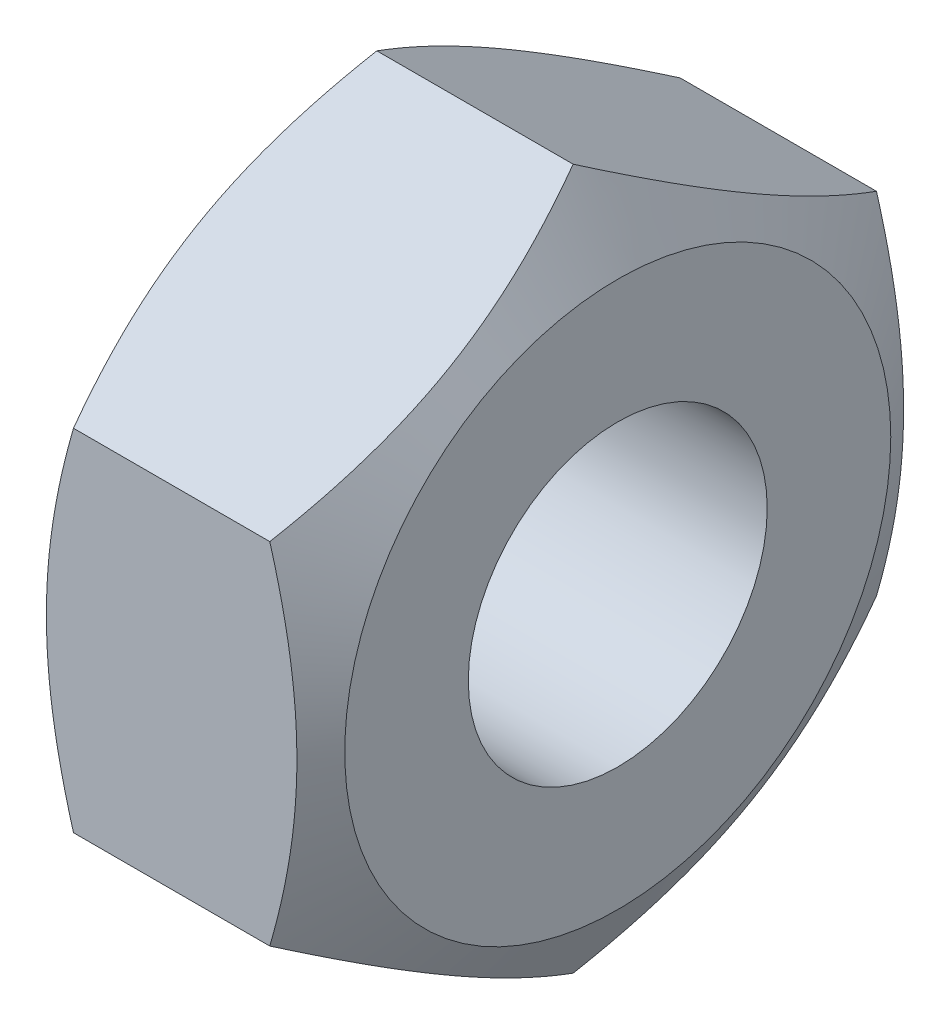
ISO-10303-21;
HEADER;
FILE_DESCRIPTION(('STEP AP214'),'2;1');
FILE_NAME('part.step','',(''),(''),'','','');
FILE_SCHEMA(('AUTOMOTIVE_DESIGN { 1 0 10303 214 1 1 1 1 }'));
ENDSEC;
DATA;
#1=APPLICATION_CONTEXT('core data for automotive mechanical design processes');
#2=APPLICATION_PROTOCOL_DEFINITION('international standard','automotive_design',2000,#1);
#3=PRODUCT_CONTEXT('',#1,'mechanical');
#4=PRODUCT('Part','Part','',(#3));
#5=PRODUCT_RELATED_PRODUCT_CATEGORY('part','',(#4));
#6=PRODUCT_DEFINITION_FORMATION('','',#4);
#7=PRODUCT_DEFINITION_CONTEXT('part definition',#1,'design');
#8=PRODUCT_DEFINITION('design','',#6,#7);
#9=PRODUCT_DEFINITION_SHAPE('','',#8);
#10=(LENGTH_UNIT() NAMED_UNIT(*) SI_UNIT(.MILLI.,.METRE.));
#11=(NAMED_UNIT(*) PLANE_ANGLE_UNIT() SI_UNIT($,.RADIAN.));
#12=(NAMED_UNIT(*) SI_UNIT($,.STERADIAN.) SOLID_ANGLE_UNIT());
#13=UNCERTAINTY_MEASURE_WITH_UNIT(LENGTH_MEASURE(1.E-05),#10,'distance_accuracy_value','');
#14=(GEOMETRIC_REPRESENTATION_CONTEXT(3) GLOBAL_UNCERTAINTY_ASSIGNED_CONTEXT((#13)) GLOBAL_UNIT_ASSIGNED_CONTEXT((#10,
#11,#12)) REPRESENTATION_CONTEXT('',''));
#15=CARTESIAN_POINT('',(0.,0.,0.));
#16=DIRECTION('',(0.,0.,1.));
#17=DIRECTION('',(1.,0.,0.));
#18=AXIS2_PLACEMENT_3D('',#15,#16,#17);
#19=CARTESIAN_POINT('',(9.,-4.90747728811182,8.5));
#20=DIRECTION('',(0.,0.866025403784439,-0.5));
#21=DIRECTION('',(-1.,0.,0.));
#22=AXIS2_PLACEMENT_3D('',#19,#20,#21);
#23=PLANE('',#22);
#24=DIRECTION('',(-1.,0.,0.));
#25=VECTOR('',#24,1.);
#26=CARTESIAN_POINT('',(9.,-9.81495457622364,0.));
#27=LINE('',#26,#25);
#28=CARTESIAN_POINT('',(6.75006289263397,-9.81495457622364,0.));
#29=VERTEX_POINT('',#28);
#30=CARTESIAN_POINT('',(1.24993710736603,-9.81495457622364,0.));
#31=VERTEX_POINT('',#30);
#32=EDGE_CURVE('E11',#29,#31,#27,.T.);
#33=ORIENTED_EDGE('',*,*,#32,.F.);
#34=CARTESIAN_POINT('',(6.75006289262925,-4.90747728810365,8.50000000001416));
#35=CARTESIAN_POINT('',(8.16672955930417,-7.36121593216773,4.25));
#36=CARTESIAN_POINT('',(6.75006289262925,-9.8149545762318,-1.41468096338611E-11));
#37=(BOUNDED_CURVE() B_SPLINE_CURVE(2,(#34,#35,#36),.UNSPECIFIED.,.F.,
.F.) B_SPLINE_CURVE_WITH_KNOTS((3,3),(-3.28197856606582,-1.43629970297824),
.UNSPECIFIED.) CURVE() GEOMETRIC_REPRESENTATION_ITEM() RATIONAL_B_SPLINE_CURVE((1.74869346263732,
2.01921728276927,1.74869346263732)) REPRESENTATION_ITEM(''));
#38=CARTESIAN_POINT('',(6.75006289263397,-4.90747728811182,8.5));
#39=VERTEX_POINT('',#38);
#40=EDGE_CURVE('E203',#39,#29,#37,.T.);
#41=ORIENTED_EDGE('',*,*,#40,.F.);
#42=DIRECTION('',(-1.,0.,0.));
#43=VECTOR('',#42,1.);
#44=CARTESIAN_POINT('',(9.,-4.90747728811182,8.5));
#45=LINE('',#44,#43);
#46=CARTESIAN_POINT('',(1.24993710736603,-4.90747728811182,8.5));
#47=VERTEX_POINT('',#46);
#48=EDGE_CURVE('E237',#39,#47,#45,.T.);
#49=ORIENTED_EDGE('',*,*,#48,.T.);
#50=CARTESIAN_POINT('',(1.24993710736889,-9.8149545762286,-8.60834302735103E-12));
#51=CARTESIAN_POINT('',(-0.166729559302786,-7.36121593216773,4.25));
#52=CARTESIAN_POINT('',(1.24993710736889,-4.90747728810685,8.50000000000861));
#53=(BOUNDED_CURVE() B_SPLINE_CURVE(2,(#50,#51,#52),.UNSPECIFIED.,.F.,
.F.) B_SPLINE_CURVE_WITH_KNOTS((3,3),(-3.14718166720087,-1.35643726516677),
.UNSPECIFIED.) CURVE() GEOMETRIC_REPRESENTATION_ITEM() RATIONAL_B_SPLINE_CURVE((1.70034817503808,
1.96339295314964,1.70034817503808)) REPRESENTATION_ITEM(''));
#54=EDGE_CURVE('E147',#31,#47,#53,.T.);
#55=ORIENTED_EDGE('',*,*,#54,.F.);
#56=EDGE_LOOP('',(#33,#41,#49,#55));
#57=FACE_BOUND('',#56,.T.);
#58=ADVANCED_FACE('F17',(#57),#23,.F.);
#59=CARTESIAN_POINT('',(9.,-9.81495457622364,0.));
#60=DIRECTION('',(0.,0.866025403784439,0.5));
#61=DIRECTION('',(1.,0.,0.));
#62=AXIS2_PLACEMENT_3D('',#59,#60,#61);
#63=PLANE('',#62);
#64=DIRECTION('',(-1.,0.,0.));
#65=VECTOR('',#64,1.);
#66=CARTESIAN_POINT('',(9.,-4.90747728811182,-8.5));
#67=LINE('',#66,#65);
#68=CARTESIAN_POINT('',(6.75006289263397,-4.90747728811182,-8.5));
#69=VERTEX_POINT('',#68);
#70=CARTESIAN_POINT('',(1.24993710736603,-4.90747728811182,-8.5));
#71=VERTEX_POINT('',#70);
#72=EDGE_CURVE('E25',#69,#71,#67,.T.);
#73=ORIENTED_EDGE('',*,*,#72,.F.);
#74=CARTESIAN_POINT('',(6.75006289262925,-9.8149545762318,1.41605231964976E-11));
#75=CARTESIAN_POINT('',(8.16672955930417,-7.36121593216774,-4.24999999999999));
#76=CARTESIAN_POINT('',(6.75006289262925,-4.90747728810366,-8.50000000001414));
#77=(BOUNDED_CURVE() B_SPLINE_CURVE(2,(#74,#75,#76),.UNSPECIFIED.,.F.,
.F.) B_SPLINE_CURVE_WITH_KNOTS((3,3),(-3.28197856606582,-1.43629970297824),
.UNSPECIFIED.) CURVE() GEOMETRIC_REPRESENTATION_ITEM() RATIONAL_B_SPLINE_CURVE((1.74869346263732,
2.01921728276927,1.74869346263732)) REPRESENTATION_ITEM(''));
#78=EDGE_CURVE('E358',#29,#69,#77,.T.);
#79=ORIENTED_EDGE('',*,*,#78,.F.);
#80=ORIENTED_EDGE('',*,*,#32,.T.);
#81=CARTESIAN_POINT('',(1.2499371073689,-4.90747728810685,-8.50000000000862));
#82=CARTESIAN_POINT('',(-0.166729559302785,-7.36121593216773,-4.25000000000001));
#83=CARTESIAN_POINT('',(1.24993710736889,-9.8149545762286,8.60259716732064E-12));
#84=(BOUNDED_CURVE() B_SPLINE_CURVE(2,(#81,#82,#83),.UNSPECIFIED.,.F.,
.F.) B_SPLINE_CURVE_WITH_KNOTS((3,3),(-3.14718166720087,-1.35643726516677),
.UNSPECIFIED.) CURVE() GEOMETRIC_REPRESENTATION_ITEM() RATIONAL_B_SPLINE_CURVE((1.70034817503808,
1.96339295314964,1.70034817503808)) REPRESENTATION_ITEM(''));
#85=EDGE_CURVE('E128',#71,#31,#84,.T.);
#86=ORIENTED_EDGE('',*,*,#85,.F.);
#87=EDGE_LOOP('',(#73,#79,#80,#86));
#88=FACE_BOUND('',#87,.T.);
#89=ADVANCED_FACE('F321',(#88),#63,.F.);
#90=CARTESIAN_POINT('',(9.,-4.90747728811182,-8.5));
#91=DIRECTION('',(0.,0.,1.));
#92=DIRECTION('',(1.,0.,0.));
#93=AXIS2_PLACEMENT_3D('',#90,#91,#92);
#94=PLANE('',#93);
#95=DIRECTION('',(-1.,0.,0.));
#96=VECTOR('',#95,1.);
#97=CARTESIAN_POINT('',(9.,4.90747728811182,-8.5));
#98=LINE('',#97,#96);
#99=CARTESIAN_POINT('',(6.75006289263397,4.90747728811182,-8.5));
#100=VERTEX_POINT('',#99);
#101=CARTESIAN_POINT('',(1.24993710736603,4.90747728811182,-8.5));
#102=VERTEX_POINT('',#101);
#103=EDGE_CURVE('E46',#100,#102,#98,.T.);
#104=ORIENTED_EDGE('',*,*,#103,.F.);
#105=CARTESIAN_POINT('',(7.50925227118881,0.,-8.50000000000001));
#106=CARTESIAN_POINT('',(7.50925227118881,2.27756813567111,-8.50000000000001));
#107=CARTESIAN_POINT('',(6.75006289262925,4.90747728812815,-8.49999999999999));
#108=(BOUNDED_CURVE() B_SPLINE_CURVE(2,(#105,#106,#107),.UNSPECIFIED.,.F.,
.F.) B_SPLINE_CURVE_WITH_KNOTS((3,3),(-2.359139134522,-1.43629970297822),
.UNSPECIFIED.) CURVE() GEOMETRIC_REPRESENTATION_ITEM() RATIONAL_B_SPLINE_CURVE((1.88395537270328,
1.88395537270328,1.7486934626373)) REPRESENTATION_ITEM(''));
#109=CARTESIAN_POINT('',(7.50925227118881,0.,-8.5));
#110=VERTEX_POINT('',#109);
#111=EDGE_CURVE('E217',#110,#100,#108,.T.);
#112=ORIENTED_EDGE('',*,*,#111,.F.);
#113=CARTESIAN_POINT('',(6.75006289262925,-4.90747728812815,-8.49999999999999));
#114=CARTESIAN_POINT('',(7.50925227118881,-2.27756813567111,-8.50000000000001));
#115=CARTESIAN_POINT('',(7.50925227118881,0.,-8.50000000000001));
#116=(BOUNDED_CURVE() B_SPLINE_CURVE(2,(#113,#114,#115),.UNSPECIFIED.,.F.,
.F.) B_SPLINE_CURVE_WITH_KNOTS((3,3),(-3.28197856606577,-2.359139134522),
.UNSPECIFIED.) CURVE() GEOMETRIC_REPRESENTATION_ITEM() RATIONAL_B_SPLINE_CURVE((1.7486934626373,
1.88395537270328,1.88395537270328)) REPRESENTATION_ITEM(''));
#117=EDGE_CURVE('E214',#69,#110,#116,.T.);
#118=ORIENTED_EDGE('',*,*,#117,.F.);
#119=ORIENTED_EDGE('',*,*,#72,.T.);
#120=CARTESIAN_POINT('',(1.24993710736868,4.90747728812104,-8.5));
#121=CARTESIAN_POINT('',(-0.166729559302632,0.,-8.5));
#122=CARTESIAN_POINT('',(1.24993710736868,-4.90747728812104,-8.5));
#123=(BOUNDED_CURVE() B_SPLINE_CURVE(2,(#120,#121,#122),.UNSPECIFIED.,.F.,
.F.) B_SPLINE_CURVE_WITH_KNOTS((3,3),(-3.1279193957715,-1.345009786714),
.UNSPECIFIED.) CURVE() GEOMETRIC_REPRESENTATION_ITEM() RATIONAL_B_SPLINE_CURVE((1.69345376639804,
1.9554319757811,1.69345376639804)) REPRESENTATION_ITEM(''));
#124=EDGE_CURVE('E121',#102,#71,#123,.T.);
#125=ORIENTED_EDGE('',*,*,#124,.F.);
#126=EDGE_LOOP('',(#104,#112,#118,#119,#125));
#127=FACE_BOUND('',#126,.T.);
#128=ADVANCED_FACE('F122',(#127),#94,.F.);
#129=CARTESIAN_POINT('',(9.,4.90747728811182,-8.5));
#130=DIRECTION('',(0.,-0.866025403784439,0.5));
#131=DIRECTION('',(-1.,0.,0.));
#132=AXIS2_PLACEMENT_3D('',#129,#130,#131);
#133=PLANE('',#132);
#134=DIRECTION('',(-1.,0.,0.));
#135=VECTOR('',#134,1.);
#136=CARTESIAN_POINT('',(9.,9.81495457622364,0.));
#137=LINE('',#136,#135);
#138=CARTESIAN_POINT('',(6.75006289263397,9.81495457622364,0.));
#139=VERTEX_POINT('',#138);
#140=CARTESIAN_POINT('',(1.24993710736603,9.81495457622364,0.));
#141=VERTEX_POINT('',#140);
#142=EDGE_CURVE('E118',#139,#141,#137,.T.);
#143=ORIENTED_EDGE('',*,*,#142,.F.);
#144=CARTESIAN_POINT('',(6.75006289262925,4.90747728810365,-8.50000000001416));
#145=CARTESIAN_POINT('',(8.16672955930417,7.36121593216773,-4.25));
#146=CARTESIAN_POINT('',(6.75006289262925,9.8149545762318,1.41468096338611E-11));
#147=(BOUNDED_CURVE() B_SPLINE_CURVE(2,(#144,#145,#146),.UNSPECIFIED.,.F.,
.F.) B_SPLINE_CURVE_WITH_KNOTS((3,3),(-3.28197856606582,-1.43629970297824),
.UNSPECIFIED.) CURVE() GEOMETRIC_REPRESENTATION_ITEM() RATIONAL_B_SPLINE_CURVE((1.74869346263732,
2.01921728276927,1.74869346263732)) REPRESENTATION_ITEM(''));
#148=EDGE_CURVE('E115',#100,#139,#147,.T.);
#149=ORIENTED_EDGE('',*,*,#148,.F.);
#150=ORIENTED_EDGE('',*,*,#103,.T.);
#151=CARTESIAN_POINT('',(1.24993710736889,9.8149545762286,8.60834302735103E-12));
#152=CARTESIAN_POINT('',(-0.166729559302786,7.36121593216773,-4.25));
#153=CARTESIAN_POINT('',(1.24993710736889,4.90747728810685,-8.50000000000861));
#154=(BOUNDED_CURVE() B_SPLINE_CURVE(2,(#151,#152,#153),.UNSPECIFIED.,.F.,
.F.) B_SPLINE_CURVE_WITH_KNOTS((3,3),(-3.14718166720087,-1.35643726516677),
.UNSPECIFIED.) CURVE() GEOMETRIC_REPRESENTATION_ITEM() RATIONAL_B_SPLINE_CURVE((1.70034817503808,
1.96339295314964,1.70034817503808)) REPRESENTATION_ITEM(''));
#155=EDGE_CURVE('E112',#141,#102,#154,.T.);
#156=ORIENTED_EDGE('',*,*,#155,.F.);
#157=EDGE_LOOP('',(#143,#149,#150,#156));
#158=FACE_BOUND('',#157,.T.);
#159=ADVANCED_FACE('F110',(#158),#133,.F.);
#160=CARTESIAN_POINT('',(9.,9.81495457622364,0.));
#161=DIRECTION('',(0.,-0.866025403784439,-0.5));
#162=DIRECTION('',(0.,0.5,-0.866025403784439));
#163=AXIS2_PLACEMENT_3D('',#160,#161,#162);
#164=PLANE('',#163);
#165=DIRECTION('',(-1.,0.,0.));
#166=VECTOR('',#165,1.);
#167=CARTESIAN_POINT('',(9.,4.90747728811182,8.5));
#168=LINE('',#167,#166);
#169=CARTESIAN_POINT('',(6.75006289263397,4.90747728811182,8.5));
#170=VERTEX_POINT('',#169);
#171=CARTESIAN_POINT('',(1.24993710736603,4.90747728811182,8.5));
#172=VERTEX_POINT('',#171);
#173=EDGE_CURVE('E240',#170,#172,#168,.T.);
#174=ORIENTED_EDGE('',*,*,#173,.F.);
#175=CARTESIAN_POINT('',(6.75006289262923,9.81495457623183,-1.41691576618614E-11));
#176=CARTESIAN_POINT('',(8.16672955930417,7.36121593216774,4.24999999999999));
#177=CARTESIAN_POINT('',(6.75006289262925,4.90747728810366,8.50000000001414));
#178=(BOUNDED_CURVE() B_SPLINE_CURVE(2,(#175,#176,#177),.UNSPECIFIED.,.F.,
.F.) B_SPLINE_CURVE_WITH_KNOTS((3,3),(-3.28197856606582,-1.43629970297824),
.UNSPECIFIED.) CURVE() GEOMETRIC_REPRESENTATION_ITEM() RATIONAL_B_SPLINE_CURVE((1.74869346263732,
2.01921728276927,1.74869346263732)) REPRESENTATION_ITEM(''));
#179=EDGE_CURVE('E156',#139,#170,#178,.T.);
#180=ORIENTED_EDGE('',*,*,#179,.F.);
#181=ORIENTED_EDGE('',*,*,#142,.T.);
#182=CARTESIAN_POINT('',(1.2499371073689,4.90747728810685,8.50000000000862));
#183=CARTESIAN_POINT('',(-0.166729559302785,7.36121593216773,4.25000000000001));
#184=CARTESIAN_POINT('',(1.24993710736889,9.8149545762286,-8.60259716732064E-12));
#185=(BOUNDED_CURVE() B_SPLINE_CURVE(2,(#182,#183,#184),.UNSPECIFIED.,.F.,
.F.) B_SPLINE_CURVE_WITH_KNOTS((3,3),(-3.14718166720087,-1.35643726516677),
.UNSPECIFIED.) CURVE() GEOMETRIC_REPRESENTATION_ITEM() RATIONAL_B_SPLINE_CURVE((1.70034817503808,
1.96339295314964,1.70034817503808)) REPRESENTATION_ITEM(''));
#186=EDGE_CURVE('E133',#172,#141,#185,.T.);
#187=ORIENTED_EDGE('',*,*,#186,.F.);
#188=EDGE_LOOP('',(#174,#180,#181,#187));
#189=FACE_BOUND('',#188,.T.);
#190=ADVANCED_FACE('F260',(#189),#164,.F.);
#191=CARTESIAN_POINT('',(9.,4.90747728811182,8.5));
#192=DIRECTION('',(0.,0.,-1.));
#193=DIRECTION('',(0.,-1.,0.));
#194=AXIS2_PLACEMENT_3D('',#191,#192,#193);
#195=PLANE('',#194);
#196=ORIENTED_EDGE('',*,*,#48,.F.);
#197=CARTESIAN_POINT('',(6.75006289262925,4.90747728812815,8.49999999999999));
#198=CARTESIAN_POINT('',(8.16672955930416,0.,8.50000000000001));
#199=CARTESIAN_POINT('',(6.75006289262925,-4.90747728812816,8.49999999999999));
#200=(BOUNDED_CURVE() B_SPLINE_CURVE(2,(#197,#198,#199),.UNSPECIFIED.,.F.,
.F.) B_SPLINE_CURVE_WITH_KNOTS((3,3),(-3.28197856606577,-1.43629970297822),
.UNSPECIFIED.) CURVE() GEOMETRIC_REPRESENTATION_ITEM() RATIONAL_B_SPLINE_CURVE((1.7486934626373,
2.01921728276925,1.7486934626373)) REPRESENTATION_ITEM(''));
#201=EDGE_CURVE('E164',#170,#39,#200,.T.);
#202=ORIENTED_EDGE('',*,*,#201,.F.);
#203=ORIENTED_EDGE('',*,*,#173,.T.);
#204=CARTESIAN_POINT('',(0.49074772881118,0.,8.5));
#205=CARTESIAN_POINT('',(0.49074772881118,2.27756813566825,8.5));
#206=CARTESIAN_POINT('',(1.24993710736868,4.90747728812104,8.5));
#207=(BOUNDED_CURVE() B_SPLINE_CURVE(2,(#204,#205,#206),.UNSPECIFIED.,.F.,
.F.) B_SPLINE_CURVE_WITH_KNOTS((3,3),(-2.23646459124275,-1.345009786714),
.UNSPECIFIED.) CURVE() GEOMETRIC_REPRESENTATION_ITEM() RATIONAL_B_SPLINE_CURVE((1.82444287108957,
1.82444287108957,1.69345376639804)) REPRESENTATION_ITEM(''));
#208=CARTESIAN_POINT('',(0.49074772881118,0.,8.5));
#209=VERTEX_POINT('',#208);
#210=EDGE_CURVE('E165',#209,#172,#207,.T.);
#211=ORIENTED_EDGE('',*,*,#210,.F.);
#212=CARTESIAN_POINT('',(1.24993710736868,-4.90747728812104,8.5));
#213=CARTESIAN_POINT('',(0.49074772881118,-2.27756813566825,8.5));
#214=CARTESIAN_POINT('',(0.49074772881118,0.,8.5));
#215=(BOUNDED_CURVE() B_SPLINE_CURVE(2,(#212,#213,#214),.UNSPECIFIED.,.F.,
.F.) B_SPLINE_CURVE_WITH_KNOTS((3,3),(-3.1279193957715,-2.23646459124275),
.UNSPECIFIED.) CURVE() GEOMETRIC_REPRESENTATION_ITEM() RATIONAL_B_SPLINE_CURVE((1.69345376639804,
1.82444287108957,1.82444287108957)) REPRESENTATION_ITEM(''));
#216=EDGE_CURVE('E155',#47,#209,#215,.T.);
#217=ORIENTED_EDGE('',*,*,#216,.F.);
#218=EDGE_LOOP('',(#196,#202,#203,#211,#217));
#219=FACE_BOUND('',#218,.T.);
#220=ADVANCED_FACE('F265',(#219),#195,.F.);
#221=CARTESIAN_POINT('',(8.,0.,0.));
#222=DIRECTION('',(1.,0.,0.));
#223=DIRECTION('',(0.,0.,-1.));
#224=AXIS2_PLACEMENT_3D('',#221,#222,#223);
#225=CYLINDRICAL_SURFACE('',#224,4.188);
#226=CARTESIAN_POINT('',(0.,0.,0.));
#227=DIRECTION('',(1.,0.,0.));
#228=DIRECTION('',(0.,0.,-1.));
#229=AXIS2_PLACEMENT_3D('',#226,#227,#228);
#230=CIRCLE('',#229,4.188);
#231=CARTESIAN_POINT('',(0.,0.,4.188));
#232=VERTEX_POINT('',#231);
#233=EDGE_CURVE('E139',#232,#232,#230,.T.);
#234=ORIENTED_EDGE('',*,*,#233,.F.);
#235=DIRECTION('',(1.,0.,0.));
#236=VECTOR('',#235,1.);
#237=CARTESIAN_POINT('',(8.,0.,4.188));
#238=LINE('',#237,#236);
#239=CARTESIAN_POINT('',(8.,0.,4.188));
#240=VERTEX_POINT('',#239);
#241=EDGE_CURVE('E37',#232,#240,#238,.T.);
#242=ORIENTED_EDGE('',*,*,#241,.T.);
#243=CARTESIAN_POINT('',(8.,0.,0.));
#244=DIRECTION('',(1.,0.,0.));
#245=DIRECTION('',(0.,0.,-1.));
#246=AXIS2_PLACEMENT_3D('',#243,#244,#245);
#247=CIRCLE('',#246,4.188);
#248=EDGE_CURVE('E229',#240,#240,#247,.T.);
#249=ORIENTED_EDGE('',*,*,#248,.T.);
#250=ORIENTED_EDGE('',*,*,#241,.F.);
#251=EDGE_LOOP('',(#234,#242,#249,#250));
#252=FACE_BOUND('',#251,.T.);
#253=ADVANCED_FACE('F292',(#252),#225,.F.);
#254=CARTESIAN_POINT('',(8.,7.65,0.));
#255=DIRECTION('',(-1.,0.,0.));
#256=DIRECTION('',(0.,0.,1.));
#257=AXIS2_PLACEMENT_3D('',#254,#255,#256);
#258=PLANE('',#257);
#259=ORIENTED_EDGE('',*,*,#248,.F.);
#260=EDGE_LOOP('',(#259));
#261=FACE_BOUND('',#260,.T.);
#262=CARTESIAN_POINT('',(8.,0.,0.));
#263=DIRECTION('',(1.,0.,0.));
#264=DIRECTION('',(0.,0.,-1.));
#265=AXIS2_PLACEMENT_3D('',#262,#263,#264);
#266=CIRCLE('',#265,7.65);
#267=CARTESIAN_POINT('',(8.,0.,-7.65));
#268=VERTEX_POINT('',#267);
#269=EDGE_CURVE('E213',#268,#268,#266,.T.);
#270=ORIENTED_EDGE('',*,*,#269,.T.);
#271=EDGE_LOOP('',(#270));
#272=FACE_BOUND('',#271,.T.);
#273=ADVANCED_FACE('F277',(#261,#272),#258,.F.);
#274=CARTESIAN_POINT('',(6.52775681356645,0.,0.));
#275=DIRECTION('',(-1.,0.,0.));
#276=DIRECTION('',(0.,0.,1.));
#277=AXIS2_PLACEMENT_3D('',#274,#275,#276);
#278=CONICAL_SURFACE('',#277,10.2,1.0471975511966);
#279=ORIENTED_EDGE('',*,*,#179,.T.);
#280=ORIENTED_EDGE('',*,*,#201,.T.);
#281=ORIENTED_EDGE('',*,*,#40,.T.);
#282=ORIENTED_EDGE('',*,*,#78,.T.);
#283=ORIENTED_EDGE('',*,*,#117,.T.);
#284=DIRECTION('',(0.5,0.,0.86602540378444));
#285=VECTOR('',#284,1.);
#286=CARTESIAN_POINT('',(6.52775681356645,0.,-10.2));
#287=LINE('',#286,#285);
#288=EDGE_CURVE('E209',#110,#268,#287,.T.);
#289=ORIENTED_EDGE('',*,*,#288,.T.);
#290=ORIENTED_EDGE('',*,*,#269,.F.);
#291=ORIENTED_EDGE('',*,*,#288,.F.);
#292=ORIENTED_EDGE('',*,*,#111,.T.);
#293=ORIENTED_EDGE('',*,*,#148,.T.);
#294=EDGE_LOOP('',(#279,#280,#281,#282,#283,#289,#290,#291,#292,#293));
#295=FACE_BOUND('',#294,.T.);
#296=ADVANCED_FACE('F272',(#295),#278,.T.);
#297=CARTESIAN_POINT('',(0.,0.,0.));
#298=DIRECTION('',(1.,0.,0.));
#299=DIRECTION('',(0.,0.,-1.));
#300=AXIS2_PLACEMENT_3D('',#297,#298,#299);
#301=CONICAL_SURFACE('',#300,7.65,1.0471975511966);
#302=ORIENTED_EDGE('',*,*,#186,.T.);
#303=ORIENTED_EDGE('',*,*,#155,.T.);
#304=ORIENTED_EDGE('',*,*,#124,.T.);
#305=ORIENTED_EDGE('',*,*,#85,.T.);
#306=ORIENTED_EDGE('',*,*,#54,.T.);
#307=ORIENTED_EDGE('',*,*,#216,.T.);
#308=DIRECTION('',(-0.5,0.,-0.86602540378444));
#309=VECTOR('',#308,1.);
#310=CARTESIAN_POINT('',(0.,0.,7.65));
#311=LINE('',#310,#309);
#312=CARTESIAN_POINT('',(0.,0.,7.65));
#313=VERTEX_POINT('',#312);
#314=EDGE_CURVE('E179',#209,#313,#311,.T.);
#315=ORIENTED_EDGE('',*,*,#314,.T.);
#316=CARTESIAN_POINT('',(0.,0.,0.));
#317=DIRECTION('',(1.,0.,0.));
#318=DIRECTION('',(0.,0.,-1.));
#319=AXIS2_PLACEMENT_3D('',#316,#317,#318);
#320=CIRCLE('',#319,7.65);
#321=EDGE_CURVE('E372',#313,#313,#320,.T.);
#322=ORIENTED_EDGE('',*,*,#321,.T.);
#323=ORIENTED_EDGE('',*,*,#314,.F.);
#324=ORIENTED_EDGE('',*,*,#210,.T.);
#325=EDGE_LOOP('',(#302,#303,#304,#305,#306,#307,#315,#322,#323,#324));
#326=FACE_BOUND('',#325,.T.);
#327=ADVANCED_FACE('F130',(#326),#301,.T.);
#328=CARTESIAN_POINT('',(0.,0.,0.));
#329=DIRECTION('',(1.,0.,0.));
#330=DIRECTION('',(0.,1.,0.));
#331=AXIS2_PLACEMENT_3D('',#328,#329,#330);
#332=PLANE('',#331);
#333=ORIENTED_EDGE('',*,*,#233,.T.);
#334=EDGE_LOOP('',(#333));
#335=FACE_BOUND('',#334,.T.);
#336=ORIENTED_EDGE('',*,*,#321,.F.);
#337=EDGE_LOOP('',(#336));
#338=FACE_BOUND('',#337,.T.);
#339=ADVANCED_FACE('F249',(#335,#338),#332,.F.);
#340=CLOSED_SHELL('',(#58,#89,#128,#159,#190,#220,#253,#273,#296,#327,#339));
#341=MANIFOLD_SOLID_BREP('B1',#340);
#342=ADVANCED_BREP_SHAPE_REPRESENTATION('',(#18,#341),#14);
#343=SHAPE_DEFINITION_REPRESENTATION(#9,#342);
ENDSEC;
END-ISO-10303-21;
